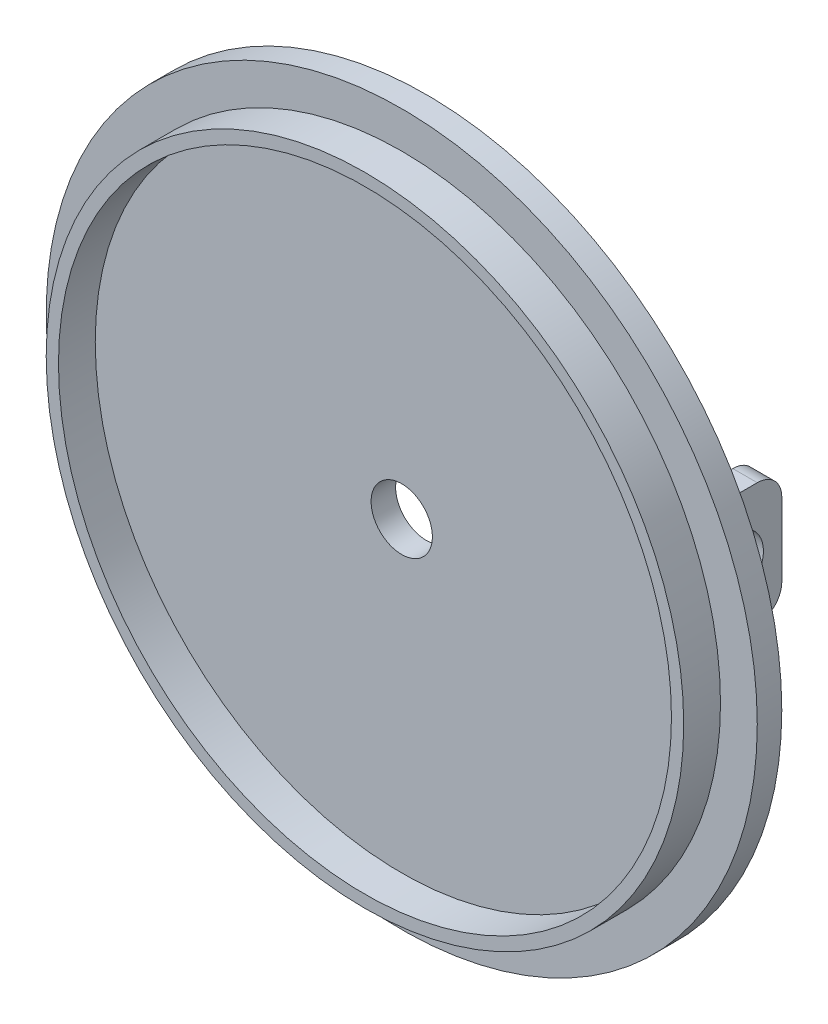
ISO-10303-21;
HEADER;
FILE_DESCRIPTION(('STEP AP214'),'2;1');
FILE_NAME('part.step','',(''),(''),'','','');
FILE_SCHEMA(('AUTOMOTIVE_DESIGN { 1 0 10303 214 1 1 1 1 }'));
ENDSEC;
DATA;
#1=APPLICATION_CONTEXT('core data for automotive mechanical design processes');
#2=APPLICATION_PROTOCOL_DEFINITION('international standard','automotive_design',2000,#1);
#3=PRODUCT_CONTEXT('',#1,'mechanical');
#4=PRODUCT('Part','Part','',(#3));
#5=PRODUCT_RELATED_PRODUCT_CATEGORY('part','',(#4));
#6=PRODUCT_DEFINITION_FORMATION('','',#4);
#7=PRODUCT_DEFINITION_CONTEXT('part definition',#1,'design');
#8=PRODUCT_DEFINITION('design','',#6,#7);
#9=PRODUCT_DEFINITION_SHAPE('','',#8);
#10=(LENGTH_UNIT() NAMED_UNIT(*) SI_UNIT(.MILLI.,.METRE.));
#11=(NAMED_UNIT(*) PLANE_ANGLE_UNIT() SI_UNIT($,.RADIAN.));
#12=(NAMED_UNIT(*) SI_UNIT($,.STERADIAN.) SOLID_ANGLE_UNIT());
#13=UNCERTAINTY_MEASURE_WITH_UNIT(LENGTH_MEASURE(1.E-05),#10,'distance_accuracy_value','');
#14=(GEOMETRIC_REPRESENTATION_CONTEXT(3) GLOBAL_UNCERTAINTY_ASSIGNED_CONTEXT((#13)) GLOBAL_UNIT_ASSIGNED_CONTEXT((#10,
#11,#12)) REPRESENTATION_CONTEXT('',''));
#15=CARTESIAN_POINT('',(0.,0.,0.));
#16=DIRECTION('',(0.,0.,1.));
#17=DIRECTION('',(1.,0.,0.));
#18=AXIS2_PLACEMENT_3D('',#15,#16,#17);
#19=CARTESIAN_POINT('',(0.,0.,0.));
#20=DIRECTION('',(0.,0.,1.));
#21=DIRECTION('',(1.,0.,0.));
#22=AXIS2_PLACEMENT_3D('',#19,#20,#21);
#23=PLANE('',#22);
#24=CARTESIAN_POINT('',(16.,7.5,0.));
#25=DIRECTION('',(0.,0.,-1.));
#26=DIRECTION('',(-1.,0.,0.));
#27=AXIS2_PLACEMENT_3D('',#24,#25,#26);
#28=CIRCLE('',#27,2.25);
#29=CARTESIAN_POINT('',(13.75,7.5,0.));
#30=VERTEX_POINT('',#29);
#31=CARTESIAN_POINT('',(18.25,7.5,0.));
#32=VERTEX_POINT('',#31);
#33=EDGE_CURVE('E306',#30,#32,#28,.T.);
#34=ORIENTED_EDGE('',*,*,#33,.F.);
#35=DIRECTION('',(0.,1.,0.));
#36=VECTOR('',#35,1.);
#37=CARTESIAN_POINT('',(13.75,7.5,0.));
#38=LINE('',#37,#36);
#39=CARTESIAN_POINT('',(13.75,-7.5,0.));
#40=VERTEX_POINT('',#39);
#41=EDGE_CURVE('E312',#40,#30,#38,.T.);
#42=ORIENTED_EDGE('',*,*,#41,.F.);
#43=CARTESIAN_POINT('',(16.,-7.5,0.));
#44=DIRECTION('',(0.,0.,-1.));
#45=DIRECTION('',(-1.,0.,0.));
#46=AXIS2_PLACEMENT_3D('',#43,#44,#45);
#47=CIRCLE('',#46,2.25);
#48=CARTESIAN_POINT('',(18.25,-7.5,0.));
#49=VERTEX_POINT('',#48);
#50=EDGE_CURVE('E329',#49,#40,#47,.T.);
#51=ORIENTED_EDGE('',*,*,#50,.F.);
#52=DIRECTION('',(0.,-1.,0.));
#53=VECTOR('',#52,1.);
#54=CARTESIAN_POINT('',(18.25,7.5,0.));
#55=LINE('',#54,#53);
#56=EDGE_CURVE('E325',#32,#49,#55,.T.);
#57=ORIENTED_EDGE('',*,*,#56,.F.);
#58=EDGE_LOOP('',(#34,#42,#51,#57));
#59=FACE_BOUND('',#58,.T.);
#60=CARTESIAN_POINT('',(0.,0.,0.));
#61=DIRECTION('',(0.,0.,1.));
#62=DIRECTION('',(1.,0.,0.));
#63=AXIS2_PLACEMENT_3D('',#60,#61,#62);
#64=CIRCLE('',#63,29.);
#65=CARTESIAN_POINT('',(29.,0.,0.));
#66=VERTEX_POINT('',#65);
#67=EDGE_CURVE('E368',#66,#66,#64,.T.);
#68=ORIENTED_EDGE('',*,*,#67,.F.);
#69=EDGE_LOOP('',(#68));
#70=FACE_BOUND('',#69,.T.);
#71=CARTESIAN_POINT('',(0.,0.,0.));
#72=DIRECTION('',(0.,0.,1.));
#73=DIRECTION('',(1.,0.,0.));
#74=AXIS2_PLACEMENT_3D('',#71,#72,#73);
#75=CIRCLE('',#74,2.5);
#76=CARTESIAN_POINT('',(2.5,0.,0.));
#77=VERTEX_POINT('',#76);
#78=EDGE_CURVE('E360',#77,#77,#75,.T.);
#79=ORIENTED_EDGE('',*,*,#78,.T.);
#80=EDGE_LOOP('',(#79));
#81=FACE_BOUND('',#80,.T.);
#82=CARTESIAN_POINT('',(-16.,7.5,0.));
#83=DIRECTION('',(0.,0.,-1.));
#84=DIRECTION('',(-1.,0.,0.));
#85=AXIS2_PLACEMENT_3D('',#82,#83,#84);
#86=CIRCLE('',#85,2.25);
#87=CARTESIAN_POINT('',(-18.25,7.5,0.));
#88=VERTEX_POINT('',#87);
#89=CARTESIAN_POINT('',(-13.75,7.5,0.));
#90=VERTEX_POINT('',#89);
#91=EDGE_CURVE('E261',#88,#90,#86,.T.);
#92=ORIENTED_EDGE('',*,*,#91,.F.);
#93=DIRECTION('',(0.,1.,0.));
#94=VECTOR('',#93,1.);
#95=CARTESIAN_POINT('',(-18.25,7.5,0.));
#96=LINE('',#95,#94);
#97=CARTESIAN_POINT('',(-18.25,-7.5,0.));
#98=VERTEX_POINT('',#97);
#99=EDGE_CURVE('E267',#98,#88,#96,.T.);
#100=ORIENTED_EDGE('',*,*,#99,.F.);
#101=CARTESIAN_POINT('',(-16.,-7.5,0.));
#102=DIRECTION('',(0.,0.,-1.));
#103=DIRECTION('',(-1.,0.,0.));
#104=AXIS2_PLACEMENT_3D('',#101,#102,#103);
#105=CIRCLE('',#104,2.25);
#106=CARTESIAN_POINT('',(-13.75,-7.5,0.));
#107=VERTEX_POINT('',#106);
#108=EDGE_CURVE('E284',#107,#98,#105,.T.);
#109=ORIENTED_EDGE('',*,*,#108,.F.);
#110=DIRECTION('',(0.,-1.,0.));
#111=VECTOR('',#110,1.);
#112=CARTESIAN_POINT('',(-13.75,7.5,0.));
#113=LINE('',#112,#111);
#114=EDGE_CURVE('E280',#90,#107,#113,.T.);
#115=ORIENTED_EDGE('',*,*,#114,.F.);
#116=EDGE_LOOP('',(#92,#100,#109,#115));
#117=FACE_BOUND('',#116,.T.);
#118=ADVANCED_FACE('F43',(#59,#70,#81,#117),#23,.F.);
#119=CARTESIAN_POINT('',(0.,0.,2.));
#120=DIRECTION('',(0.,0.,1.));
#121=DIRECTION('',(1.,0.,0.));
#122=AXIS2_PLACEMENT_3D('',#119,#120,#121);
#123=PLANE('',#122);
#124=CARTESIAN_POINT('',(0.,0.,2.));
#125=DIRECTION('',(0.,0.,1.));
#126=DIRECTION('',(1.,0.,0.));
#127=AXIS2_PLACEMENT_3D('',#124,#125,#126);
#128=CIRCLE('',#127,2.5);
#129=CARTESIAN_POINT('',(2.5,0.,2.));
#130=VERTEX_POINT('',#129);
#131=EDGE_CURVE('E364',#130,#130,#128,.T.);
#132=ORIENTED_EDGE('',*,*,#131,.F.);
#133=EDGE_LOOP('',(#132));
#134=FACE_BOUND('',#133,.T.);
#135=CARTESIAN_POINT('',(0.,0.,2.));
#136=DIRECTION('',(0.,0.,1.));
#137=DIRECTION('',(1.,0.,0.));
#138=AXIS2_PLACEMENT_3D('',#135,#136,#137);
#139=CIRCLE('',#138,25.);
#140=CARTESIAN_POINT('',(25.,0.,2.));
#141=VERTEX_POINT('',#140);
#142=EDGE_CURVE('E376',#141,#141,#139,.F.);
#143=ORIENTED_EDGE('',*,*,#142,.F.);
#144=EDGE_LOOP('',(#143));
#145=FACE_BOUND('',#144,.T.);
#146=ADVANCED_FACE('F474',(#134,#145),#123,.T.);
#147=CARTESIAN_POINT('',(0.,0.,2.));
#148=DIRECTION('',(0.,0.,1.));
#149=DIRECTION('',(1.,0.,0.));
#150=AXIS2_PLACEMENT_3D('',#147,#148,#149);
#151=CIRCLE('',#150,26.);
#152=CARTESIAN_POINT('',(26.,0.,2.));
#153=VERTEX_POINT('',#152);
#154=EDGE_CURVE('E355',#153,#153,#151,.T.);
#155=ORIENTED_EDGE('',*,*,#154,.F.);
#156=EDGE_LOOP('',(#155));
#157=FACE_BOUND('',#156,.T.);
#158=CARTESIAN_POINT('',(0.,0.,2.));
#159=DIRECTION('',(0.,0.,1.));
#160=DIRECTION('',(1.,0.,0.));
#161=AXIS2_PLACEMENT_3D('',#158,#159,#160);
#162=CIRCLE('',#161,29.);
#163=CARTESIAN_POINT('',(29.,0.,2.));
#164=VERTEX_POINT('',#163);
#165=EDGE_CURVE('E372',#164,#164,#162,.T.);
#166=ORIENTED_EDGE('',*,*,#165,.T.);
#167=EDGE_LOOP('',(#166));
#168=FACE_BOUND('',#167,.T.);
#169=ADVANCED_FACE('F480',(#157,#168),#123,.T.);
#170=CARTESIAN_POINT('',(0.,0.,2.));
#171=DIRECTION('',(0.,0.,-1.));
#172=DIRECTION('',(-1.,0.,0.));
#173=AXIS2_PLACEMENT_3D('',#170,#171,#172);
#174=CYLINDRICAL_SURFACE('',#173,29.);
#175=ORIENTED_EDGE('',*,*,#165,.F.);
#176=EDGE_LOOP('',(#175));
#177=FACE_BOUND('',#176,.T.);
#178=ORIENTED_EDGE('',*,*,#67,.T.);
#179=EDGE_LOOP('',(#178));
#180=FACE_BOUND('',#179,.T.);
#181=ADVANCED_FACE('F486',(#177,#180),#174,.T.);
#182=CARTESIAN_POINT('',(0.,0.,2.));
#183=DIRECTION('',(0.,0.,-1.));
#184=DIRECTION('',(-1.,0.,0.));
#185=AXIS2_PLACEMENT_3D('',#182,#183,#184);
#186=CYLINDRICAL_SURFACE('',#185,2.5);
#187=ORIENTED_EDGE('',*,*,#131,.T.);
#188=EDGE_LOOP('',(#187));
#189=FACE_BOUND('',#188,.T.);
#190=ORIENTED_EDGE('',*,*,#78,.F.);
#191=EDGE_LOOP('',(#190));
#192=FACE_BOUND('',#191,.T.);
#193=ADVANCED_FACE('F489',(#189,#192),#186,.F.);
#194=CARTESIAN_POINT('',(0.,0.,5.));
#195=DIRECTION('',(0.,0.,1.));
#196=DIRECTION('',(1.,0.,0.));
#197=AXIS2_PLACEMENT_3D('',#194,#195,#196);
#198=PLANE('',#197);
#199=CARTESIAN_POINT('',(0.,0.,5.));
#200=DIRECTION('',(0.,0.,1.));
#201=DIRECTION('',(1.,0.,0.));
#202=AXIS2_PLACEMENT_3D('',#199,#200,#201);
#203=CIRCLE('',#202,26.);
#204=CARTESIAN_POINT('',(26.,0.,5.));
#205=VERTEX_POINT('',#204);
#206=EDGE_CURVE('E356',#205,#205,#203,.T.);
#207=ORIENTED_EDGE('',*,*,#206,.T.);
#208=EDGE_LOOP('',(#207));
#209=FACE_BOUND('',#208,.T.);
#210=CARTESIAN_POINT('',(0.,0.,5.));
#211=DIRECTION('',(0.,0.,1.));
#212=DIRECTION('',(1.,0.,0.));
#213=AXIS2_PLACEMENT_3D('',#210,#211,#212);
#214=CIRCLE('',#213,25.);
#215=CARTESIAN_POINT('',(25.,0.,5.));
#216=VERTEX_POINT('',#215);
#217=EDGE_CURVE('E351',#216,#216,#214,.T.);
#218=ORIENTED_EDGE('',*,*,#217,.F.);
#219=EDGE_LOOP('',(#218));
#220=FACE_BOUND('',#219,.T.);
#221=ADVANCED_FACE('F650',(#209,#220),#198,.T.);
#222=CARTESIAN_POINT('',(0.,0.,5.));
#223=DIRECTION('',(0.,0.,-1.));
#224=DIRECTION('',(-1.,0.,0.));
#225=AXIS2_PLACEMENT_3D('',#222,#223,#224);
#226=CYLINDRICAL_SURFACE('',#225,26.);
#227=ORIENTED_EDGE('',*,*,#206,.F.);
#228=EDGE_LOOP('',(#227));
#229=FACE_BOUND('',#228,.T.);
#230=ORIENTED_EDGE('',*,*,#154,.T.);
#231=EDGE_LOOP('',(#230));
#232=FACE_BOUND('',#231,.T.);
#233=ADVANCED_FACE('F648',(#229,#232),#226,.T.);
#234=CARTESIAN_POINT('',(0.,0.,5.));
#235=DIRECTION('',(0.,0.,-1.));
#236=DIRECTION('',(-1.,0.,0.));
#237=AXIS2_PLACEMENT_3D('',#234,#235,#236);
#238=CYLINDRICAL_SURFACE('',#237,25.);
#239=ORIENTED_EDGE('',*,*,#217,.T.);
#240=EDGE_LOOP('',(#239));
#241=FACE_BOUND('',#240,.T.);
#242=ORIENTED_EDGE('',*,*,#142,.T.);
#243=EDGE_LOOP('',(#242));
#244=FACE_BOUND('',#243,.T.);
#245=ADVANCED_FACE('F644',(#241,#244),#238,.F.);
#246=CARTESIAN_POINT('',(16.,7.5,-2.));
#247=DIRECTION('',(0.,0.,1.));
#248=DIRECTION('',(1.,0.,0.));
#249=AXIS2_PLACEMENT_3D('',#246,#247,#248);
#250=CYLINDRICAL_SURFACE('',#249,2.25);
#251=ORIENTED_EDGE('',*,*,#33,.T.);
#252=DIRECTION('',(0.,0.,1.));
#253=VECTOR('',#252,1.);
#254=CARTESIAN_POINT('',(18.25,7.5,-2.));
#255=LINE('',#254,#253);
#256=CARTESIAN_POINT('',(18.25,7.5,-2.));
#257=VERTEX_POINT('',#256);
#258=EDGE_CURVE('E347',#257,#32,#255,.T.);
#259=ORIENTED_EDGE('',*,*,#258,.F.);
#260=CARTESIAN_POINT('',(16.,7.5,-2.));
#261=DIRECTION('',(0.,0.,-1.));
#262=DIRECTION('',(-1.,0.,0.));
#263=AXIS2_PLACEMENT_3D('',#260,#261,#262);
#264=CIRCLE('',#263,2.25);
#265=CARTESIAN_POINT('',(13.75,7.5,-2.));
#266=VERTEX_POINT('',#265);
#267=EDGE_CURVE('E307',#266,#257,#264,.T.);
#268=ORIENTED_EDGE('',*,*,#267,.F.);
#269=DIRECTION('',(0.,0.,1.));
#270=VECTOR('',#269,1.);
#271=CARTESIAN_POINT('',(13.75,7.5,-2.));
#272=LINE('',#271,#270);
#273=EDGE_CURVE('E321',#266,#30,#272,.T.);
#274=ORIENTED_EDGE('',*,*,#273,.T.);
#275=EDGE_LOOP('',(#251,#259,#268,#274));
#276=FACE_BOUND('',#275,.T.);
#277=ADVANCED_FACE('F640',(#276),#250,.T.);
#278=CARTESIAN_POINT('',(18.25,7.5,-2.));
#279=DIRECTION('',(-1.,0.,0.));
#280=DIRECTION('',(0.,0.,1.));
#281=AXIS2_PLACEMENT_3D('',#278,#279,#280);
#282=PLANE('',#281);
#283=ORIENTED_EDGE('',*,*,#56,.T.);
#284=DIRECTION('',(0.,0.,1.));
#285=VECTOR('',#284,1.);
#286=CARTESIAN_POINT('',(18.25,-7.5,-2.));
#287=LINE('',#286,#285);
#288=CARTESIAN_POINT('',(18.25,-7.5,-2.));
#289=VERTEX_POINT('',#288);
#290=EDGE_CURVE('E343',#289,#49,#287,.T.);
#291=ORIENTED_EDGE('',*,*,#290,.F.);
#292=DIRECTION('',(0.,-1.,0.));
#293=VECTOR('',#292,1.);
#294=CARTESIAN_POINT('',(18.25,7.5,-2.));
#295=LINE('',#294,#293);
#296=EDGE_CURVE('E311',#257,#289,#295,.T.);
#297=ORIENTED_EDGE('',*,*,#296,.F.);
#298=ORIENTED_EDGE('',*,*,#258,.T.);
#299=EDGE_LOOP('',(#283,#291,#297,#298));
#300=FACE_BOUND('',#299,.T.);
#301=ADVANCED_FACE('F636',(#300),#282,.F.);
#302=CARTESIAN_POINT('',(16.,-7.5,-2.));
#303=DIRECTION('',(0.,0.,1.));
#304=DIRECTION('',(1.,0.,0.));
#305=AXIS2_PLACEMENT_3D('',#302,#303,#304);
#306=CYLINDRICAL_SURFACE('',#305,2.25);
#307=ORIENTED_EDGE('',*,*,#50,.T.);
#308=DIRECTION('',(0.,0.,1.));
#309=VECTOR('',#308,1.);
#310=CARTESIAN_POINT('',(13.75,-7.5,-2.));
#311=LINE('',#310,#309);
#312=CARTESIAN_POINT('',(13.75,-7.5,-2.));
#313=VERTEX_POINT('',#312);
#314=EDGE_CURVE('E339',#313,#40,#311,.T.);
#315=ORIENTED_EDGE('',*,*,#314,.F.);
#316=CARTESIAN_POINT('',(16.,-7.5,-2.));
#317=DIRECTION('',(0.,0.,-1.));
#318=DIRECTION('',(-1.,0.,0.));
#319=AXIS2_PLACEMENT_3D('',#316,#317,#318);
#320=CIRCLE('',#319,2.25);
#321=EDGE_CURVE('E315',#289,#313,#320,.T.);
#322=ORIENTED_EDGE('',*,*,#321,.F.);
#323=ORIENTED_EDGE('',*,*,#290,.T.);
#324=EDGE_LOOP('',(#307,#315,#322,#323));
#325=FACE_BOUND('',#324,.T.);
#326=ADVANCED_FACE('F632',(#325),#306,.T.);
#327=CARTESIAN_POINT('',(13.75,7.5,-2.));
#328=DIRECTION('',(1.,0.,0.));
#329=DIRECTION('',(0.,1.,0.));
#330=AXIS2_PLACEMENT_3D('',#327,#328,#329);
#331=PLANE('',#330);
#332=ORIENTED_EDGE('',*,*,#41,.T.);
#333=ORIENTED_EDGE('',*,*,#273,.F.);
#334=DIRECTION('',(0.,1.,0.));
#335=VECTOR('',#334,1.);
#336=CARTESIAN_POINT('',(13.75,7.5,-2.));
#337=LINE('',#336,#335);
#338=EDGE_CURVE('E318',#313,#266,#337,.T.);
#339=ORIENTED_EDGE('',*,*,#338,.F.);
#340=ORIENTED_EDGE('',*,*,#314,.T.);
#341=EDGE_LOOP('',(#332,#333,#339,#340));
#342=FACE_BOUND('',#341,.T.);
#343=ADVANCED_FACE('F628',(#342),#331,.F.);
#344=CARTESIAN_POINT('',(16.,7.5,-2.));
#345=DIRECTION('',(0.,0.,-1.));
#346=DIRECTION('',(-1.,0.,0.));
#347=AXIS2_PLACEMENT_3D('',#344,#345,#346);
#348=PLANE('',#347);
#349=DIRECTION('',(0.,1.,0.));
#350=VECTOR('',#349,1.);
#351=CARTESIAN_POINT('',(15.,5.07539605048808,-2.));
#352=LINE('',#351,#350);
#353=CARTESIAN_POINT('',(15.,-4.92460394951192,-2.));
#354=VERTEX_POINT('',#353);
#355=CARTESIAN_POINT('',(15.,5.07539605048808,-2.));
#356=VERTEX_POINT('',#355);
#357=EDGE_CURVE('E225',#354,#356,#352,.T.);
#358=ORIENTED_EDGE('',*,*,#357,.F.);
#359=DIRECTION('',(-1.,0.,0.));
#360=VECTOR('',#359,1.);
#361=CARTESIAN_POINT('',(17.,-4.92460394951192,-2.));
#362=LINE('',#361,#360);
#363=CARTESIAN_POINT('',(17.,-4.92460394951192,-2.));
#364=VERTEX_POINT('',#363);
#365=EDGE_CURVE('E231',#364,#354,#362,.T.);
#366=ORIENTED_EDGE('',*,*,#365,.F.);
#367=DIRECTION('',(0.,-1.,0.));
#368=VECTOR('',#367,1.);
#369=CARTESIAN_POINT('',(17.,5.07539605048808,-2.));
#370=LINE('',#369,#368);
#371=CARTESIAN_POINT('',(17.,5.07539605048808,-2.));
#372=VERTEX_POINT('',#371);
#373=EDGE_CURVE('E243',#372,#364,#370,.T.);
#374=ORIENTED_EDGE('',*,*,#373,.F.);
#375=DIRECTION('',(1.,0.,0.));
#376=VECTOR('',#375,1.);
#377=CARTESIAN_POINT('',(17.,5.07539605048808,-2.));
#378=LINE('',#377,#376);
#379=EDGE_CURVE('E239',#356,#372,#378,.T.);
#380=ORIENTED_EDGE('',*,*,#379,.F.);
#381=EDGE_LOOP('',(#358,#366,#374,#380));
#382=FACE_BOUND('',#381,.T.);
#383=ORIENTED_EDGE('',*,*,#267,.T.);
#384=ORIENTED_EDGE('',*,*,#296,.T.);
#385=ORIENTED_EDGE('',*,*,#321,.T.);
#386=ORIENTED_EDGE('',*,*,#338,.T.);
#387=EDGE_LOOP('',(#383,#384,#385,#386));
#388=FACE_BOUND('',#387,.T.);
#389=ADVANCED_FACE('F624',(#382,#388),#348,.T.);
#390=CARTESIAN_POINT('',(-16.,7.5,-2.));
#391=DIRECTION('',(0.,0.,1.));
#392=DIRECTION('',(1.,0.,0.));
#393=AXIS2_PLACEMENT_3D('',#390,#391,#392);
#394=CYLINDRICAL_SURFACE('',#393,2.25);
#395=ORIENTED_EDGE('',*,*,#91,.T.);
#396=DIRECTION('',(0.,0.,1.));
#397=VECTOR('',#396,1.);
#398=CARTESIAN_POINT('',(-13.75,7.5,-2.));
#399=LINE('',#398,#397);
#400=CARTESIAN_POINT('',(-13.75,7.5,-2.));
#401=VERTEX_POINT('',#400);
#402=EDGE_CURVE('E302',#401,#90,#399,.T.);
#403=ORIENTED_EDGE('',*,*,#402,.F.);
#404=CARTESIAN_POINT('',(-16.,7.5,-2.));
#405=DIRECTION('',(0.,0.,-1.));
#406=DIRECTION('',(-1.,0.,0.));
#407=AXIS2_PLACEMENT_3D('',#404,#405,#406);
#408=CIRCLE('',#407,2.25);
#409=CARTESIAN_POINT('',(-18.25,7.5,-2.));
#410=VERTEX_POINT('',#409);
#411=EDGE_CURVE('E262',#410,#401,#408,.T.);
#412=ORIENTED_EDGE('',*,*,#411,.F.);
#413=DIRECTION('',(0.,0.,1.));
#414=VECTOR('',#413,1.);
#415=CARTESIAN_POINT('',(-18.25,7.5,-2.));
#416=LINE('',#415,#414);
#417=EDGE_CURVE('E276',#410,#88,#416,.T.);
#418=ORIENTED_EDGE('',*,*,#417,.T.);
#419=EDGE_LOOP('',(#395,#403,#412,#418));
#420=FACE_BOUND('',#419,.T.);
#421=ADVANCED_FACE('F620',(#420),#394,.T.);
#422=CARTESIAN_POINT('',(-13.75,7.5,-2.));
#423=DIRECTION('',(-1.,0.,0.));
#424=DIRECTION('',(0.,0.,1.));
#425=AXIS2_PLACEMENT_3D('',#422,#423,#424);
#426=PLANE('',#425);
#427=ORIENTED_EDGE('',*,*,#114,.T.);
#428=DIRECTION('',(0.,0.,1.));
#429=VECTOR('',#428,1.);
#430=CARTESIAN_POINT('',(-13.75,-7.5,-2.));
#431=LINE('',#430,#429);
#432=CARTESIAN_POINT('',(-13.75,-7.5,-2.));
#433=VERTEX_POINT('',#432);
#434=EDGE_CURVE('E298',#433,#107,#431,.T.);
#435=ORIENTED_EDGE('',*,*,#434,.F.);
#436=DIRECTION('',(0.,-1.,0.));
#437=VECTOR('',#436,1.);
#438=CARTESIAN_POINT('',(-13.75,7.5,-2.));
#439=LINE('',#438,#437);
#440=EDGE_CURVE('E266',#401,#433,#439,.T.);
#441=ORIENTED_EDGE('',*,*,#440,.F.);
#442=ORIENTED_EDGE('',*,*,#402,.T.);
#443=EDGE_LOOP('',(#427,#435,#441,#442));
#444=FACE_BOUND('',#443,.T.);
#445=ADVANCED_FACE('F616',(#444),#426,.F.);
#446=CARTESIAN_POINT('',(-16.,-7.5,-2.));
#447=DIRECTION('',(0.,0.,1.));
#448=DIRECTION('',(1.,0.,0.));
#449=AXIS2_PLACEMENT_3D('',#446,#447,#448);
#450=CYLINDRICAL_SURFACE('',#449,2.25);
#451=ORIENTED_EDGE('',*,*,#108,.T.);
#452=DIRECTION('',(0.,0.,1.));
#453=VECTOR('',#452,1.);
#454=CARTESIAN_POINT('',(-18.25,-7.5,-2.));
#455=LINE('',#454,#453);
#456=CARTESIAN_POINT('',(-18.25,-7.5,-2.));
#457=VERTEX_POINT('',#456);
#458=EDGE_CURVE('E294',#457,#98,#455,.T.);
#459=ORIENTED_EDGE('',*,*,#458,.F.);
#460=CARTESIAN_POINT('',(-16.,-7.5,-2.));
#461=DIRECTION('',(0.,0.,-1.));
#462=DIRECTION('',(-1.,0.,0.));
#463=AXIS2_PLACEMENT_3D('',#460,#461,#462);
#464=CIRCLE('',#463,2.25);
#465=EDGE_CURVE('E270',#433,#457,#464,.T.);
#466=ORIENTED_EDGE('',*,*,#465,.F.);
#467=ORIENTED_EDGE('',*,*,#434,.T.);
#468=EDGE_LOOP('',(#451,#459,#466,#467));
#469=FACE_BOUND('',#468,.T.);
#470=ADVANCED_FACE('F612',(#469),#450,.T.);
#471=CARTESIAN_POINT('',(-18.25,7.5,-2.));
#472=DIRECTION('',(1.,0.,0.));
#473=DIRECTION('',(0.,0.,-1.));
#474=AXIS2_PLACEMENT_3D('',#471,#472,#473);
#475=PLANE('',#474);
#476=ORIENTED_EDGE('',*,*,#99,.T.);
#477=ORIENTED_EDGE('',*,*,#417,.F.);
#478=DIRECTION('',(0.,1.,0.));
#479=VECTOR('',#478,1.);
#480=CARTESIAN_POINT('',(-18.25,7.5,-2.));
#481=LINE('',#480,#479);
#482=EDGE_CURVE('E273',#457,#410,#481,.T.);
#483=ORIENTED_EDGE('',*,*,#482,.F.);
#484=ORIENTED_EDGE('',*,*,#458,.T.);
#485=EDGE_LOOP('',(#476,#477,#483,#484));
#486=FACE_BOUND('',#485,.T.);
#487=ADVANCED_FACE('F609',(#486),#475,.F.);
#488=CARTESIAN_POINT('',(-16.,7.5,-2.));
#489=DIRECTION('',(0.,0.,-1.));
#490=DIRECTION('',(-1.,0.,0.));
#491=AXIS2_PLACEMENT_3D('',#488,#489,#490);
#492=PLANE('',#491);
#493=DIRECTION('',(0.,1.,0.));
#494=VECTOR('',#493,1.);
#495=CARTESIAN_POINT('',(-17.,5.07539605048808,-2.));
#496=LINE('',#495,#494);
#497=CARTESIAN_POINT('',(-17.,-4.92460394951192,-2.));
#498=VERTEX_POINT('',#497);
#499=CARTESIAN_POINT('',(-17.,5.07539605048808,-2.));
#500=VERTEX_POINT('',#499);
#501=EDGE_CURVE('E207',#498,#500,#496,.T.);
#502=ORIENTED_EDGE('',*,*,#501,.F.);
#503=DIRECTION('',(-1.,0.,0.));
#504=VECTOR('',#503,1.);
#505=CARTESIAN_POINT('',(-17.,-4.92460394951192,-2.));
#506=LINE('',#505,#504);
#507=CARTESIAN_POINT('',(-15.,-4.92460394951192,-2.));
#508=VERTEX_POINT('',#507);
#509=EDGE_CURVE('E202',#508,#498,#506,.T.);
#510=ORIENTED_EDGE('',*,*,#509,.F.);
#511=DIRECTION('',(0.,-1.,0.));
#512=VECTOR('',#511,1.);
#513=CARTESIAN_POINT('',(-15.,5.07539605048808,-2.));
#514=LINE('',#513,#512);
#515=CARTESIAN_POINT('',(-15.,5.07539605048808,-2.));
#516=VERTEX_POINT('',#515);
#517=EDGE_CURVE('E186',#516,#508,#514,.T.);
#518=ORIENTED_EDGE('',*,*,#517,.F.);
#519=DIRECTION('',(1.,0.,0.));
#520=VECTOR('',#519,1.);
#521=CARTESIAN_POINT('',(-17.,5.07539605048808,-2.));
#522=LINE('',#521,#520);
#523=EDGE_CURVE('E199',#500,#516,#522,.T.);
#524=ORIENTED_EDGE('',*,*,#523,.F.);
#525=EDGE_LOOP('',(#502,#510,#518,#524));
#526=FACE_BOUND('',#525,.T.);
#527=ORIENTED_EDGE('',*,*,#411,.T.);
#528=ORIENTED_EDGE('',*,*,#440,.T.);
#529=ORIENTED_EDGE('',*,*,#465,.T.);
#530=ORIENTED_EDGE('',*,*,#482,.T.);
#531=EDGE_LOOP('',(#527,#528,#529,#530));
#532=FACE_BOUND('',#531,.T.);
#533=ADVANCED_FACE('F197',(#526,#532),#492,.T.);
#534=CARTESIAN_POINT('',(15.,5.07539605048808,-12.));
#535=DIRECTION('',(1.,0.,0.));
#536=DIRECTION('',(0.,1.,0.));
#537=AXIS2_PLACEMENT_3D('',#534,#535,#536);
#538=PLANE('',#537);
#539=CARTESIAN_POINT('',(15.,0.,-8.));
#540=DIRECTION('',(1.,0.,0.));
#541=DIRECTION('',(0.,1.,0.));
#542=AXIS2_PLACEMENT_3D('',#539,#540,#541);
#543=CIRCLE('',#542,2.5);
#544=CARTESIAN_POINT('',(15.,2.49999999999999,-8.));
#545=VERTEX_POINT('',#544);
#546=EDGE_CURVE('E210',#545,#545,#543,.T.);
#547=ORIENTED_EDGE('',*,*,#546,.T.);
#548=EDGE_LOOP('',(#547));
#549=FACE_BOUND('',#548,.T.);
#550=DIRECTION('',(0.,0.,1.));
#551=VECTOR('',#550,1.);
#552=CARTESIAN_POINT('',(15.,5.07539605048808,-12.));
#553=LINE('',#552,#551);
#554=CARTESIAN_POINT('',(15.,5.07539605048808,-10.));
#555=VERTEX_POINT('',#554);
#556=EDGE_CURVE('E258',#555,#356,#553,.T.);
#557=ORIENTED_EDGE('',*,*,#556,.F.);
#558=CARTESIAN_POINT('',(15.,3.07539605048808,-10.));
#559=DIRECTION('',(1.,0.,0.));
#560=DIRECTION('',(0.,1.,0.));
#561=AXIS2_PLACEMENT_3D('',#558,#559,#560);
#562=CIRCLE('',#561,2.);
#563=CARTESIAN_POINT('',(15.,3.07539605048808,-12.));
#564=VERTEX_POINT('',#563);
#565=EDGE_CURVE('E403',#555,#564,#562,.F.);
#566=ORIENTED_EDGE('',*,*,#565,.T.);
#567=DIRECTION('',(0.,1.,0.));
#568=VECTOR('',#567,1.);
#569=CARTESIAN_POINT('',(15.,5.07539605048808,-12.));
#570=LINE('',#569,#568);
#571=CARTESIAN_POINT('',(15.,-2.92460394951192,-12.));
#572=VERTEX_POINT('',#571);
#573=EDGE_CURVE('E226',#572,#564,#570,.T.);
#574=ORIENTED_EDGE('',*,*,#573,.F.);
#575=CARTESIAN_POINT('',(15.,-2.92460394951192,-10.));
#576=DIRECTION('',(1.,0.,0.));
#577=DIRECTION('',(0.,1.,0.));
#578=AXIS2_PLACEMENT_3D('',#575,#576,#577);
#579=CIRCLE('',#578,2.);
#580=CARTESIAN_POINT('',(15.,-4.92460394951192,-10.));
#581=VERTEX_POINT('',#580);
#582=EDGE_CURVE('E400',#572,#581,#579,.F.);
#583=ORIENTED_EDGE('',*,*,#582,.T.);
#584=DIRECTION('',(0.,0.,1.));
#585=VECTOR('',#584,1.);
#586=CARTESIAN_POINT('',(15.,-4.92460394951192,-12.));
#587=LINE('',#586,#585);
#588=EDGE_CURVE('E235',#581,#354,#587,.T.);
#589=ORIENTED_EDGE('',*,*,#588,.T.);
#590=ORIENTED_EDGE('',*,*,#357,.T.);
#591=EDGE_LOOP('',(#557,#566,#574,#583,#589,#590));
#592=FACE_BOUND('',#591,.T.);
#593=ADVANCED_FACE('F513',(#549,#592),#538,.F.);
#594=CARTESIAN_POINT('',(17.,5.07539605048808,-12.));
#595=DIRECTION('',(0.,-1.,0.));
#596=DIRECTION('',(0.,0.,-1.));
#597=AXIS2_PLACEMENT_3D('',#594,#595,#596);
#598=PLANE('',#597);
#599=DIRECTION('',(0.,0.,1.));
#600=VECTOR('',#599,1.);
#601=CARTESIAN_POINT('',(17.,5.07539605048808,-12.));
#602=LINE('',#601,#600);
#603=CARTESIAN_POINT('',(17.,5.07539605048808,-10.));
#604=VERTEX_POINT('',#603);
#605=EDGE_CURVE('E255',#604,#372,#602,.T.);
#606=ORIENTED_EDGE('',*,*,#605,.F.);
#607=DIRECTION('',(1.,0.,0.));
#608=VECTOR('',#607,1.);
#609=CARTESIAN_POINT('',(15.,5.07539605048808,-10.));
#610=LINE('',#609,#608);
#611=EDGE_CURVE('E397',#604,#555,#610,.F.);
#612=ORIENTED_EDGE('',*,*,#611,.T.);
#613=ORIENTED_EDGE('',*,*,#556,.T.);
#614=ORIENTED_EDGE('',*,*,#379,.T.);
#615=EDGE_LOOP('',(#606,#612,#613,#614));
#616=FACE_BOUND('',#615,.T.);
#617=ADVANCED_FACE('F518',(#616),#598,.F.);
#618=CARTESIAN_POINT('',(17.,5.07539605048808,-12.));
#619=DIRECTION('',(-1.,0.,0.));
#620=DIRECTION('',(0.,-1.,0.));
#621=AXIS2_PLACEMENT_3D('',#618,#619,#620);
#622=PLANE('',#621);
#623=CARTESIAN_POINT('',(17.,0.,-8.));
#624=DIRECTION('',(-1.,0.,0.));
#625=DIRECTION('',(0.,-1.,0.));
#626=AXIS2_PLACEMENT_3D('',#623,#624,#625);
#627=CIRCLE('',#626,2.5);
#628=CARTESIAN_POINT('',(17.,-2.50000000000001,-8.));
#629=VERTEX_POINT('',#628);
#630=EDGE_CURVE('E448',#629,#629,#627,.T.);
#631=ORIENTED_EDGE('',*,*,#630,.T.);
#632=EDGE_LOOP('',(#631));
#633=FACE_BOUND('',#632,.T.);
#634=DIRECTION('',(0.,-1.,0.));
#635=VECTOR('',#634,1.);
#636=CARTESIAN_POINT('',(17.,5.07539605048808,-12.));
#637=LINE('',#636,#635);
#638=CARTESIAN_POINT('',(17.,3.07539605048808,-12.));
#639=VERTEX_POINT('',#638);
#640=CARTESIAN_POINT('',(17.,-2.92460394951192,-12.));
#641=VERTEX_POINT('',#640);
#642=EDGE_CURVE('E230',#639,#641,#637,.T.);
#643=ORIENTED_EDGE('',*,*,#642,.F.);
#644=CARTESIAN_POINT('',(17.,3.07539605048808,-10.));
#645=DIRECTION('',(-1.,0.,0.));
#646=DIRECTION('',(0.,-1.,0.));
#647=AXIS2_PLACEMENT_3D('',#644,#645,#646);
#648=CIRCLE('',#647,2.);
#649=EDGE_CURVE('E394',#639,#604,#648,.F.);
#650=ORIENTED_EDGE('',*,*,#649,.T.);
#651=ORIENTED_EDGE('',*,*,#605,.T.);
#652=ORIENTED_EDGE('',*,*,#373,.T.);
#653=DIRECTION('',(0.,0.,1.));
#654=VECTOR('',#653,1.);
#655=CARTESIAN_POINT('',(17.,-4.92460394951192,-12.));
#656=LINE('',#655,#654);
#657=CARTESIAN_POINT('',(17.,-4.92460394951192,-10.));
#658=VERTEX_POINT('',#657);
#659=EDGE_CURVE('E252',#658,#364,#656,.T.);
#660=ORIENTED_EDGE('',*,*,#659,.F.);
#661=CARTESIAN_POINT('',(17.,-2.92460394951192,-10.));
#662=DIRECTION('',(-1.,0.,0.));
#663=DIRECTION('',(0.,-1.,0.));
#664=AXIS2_PLACEMENT_3D('',#661,#662,#663);
#665=CIRCLE('',#664,2.);
#666=EDGE_CURVE('E391',#658,#641,#665,.F.);
#667=ORIENTED_EDGE('',*,*,#666,.T.);
#668=EDGE_LOOP('',(#643,#650,#651,#652,#660,#667));
#669=FACE_BOUND('',#668,.T.);
#670=ADVANCED_FACE('F528',(#633,#669),#622,.F.);
#671=CARTESIAN_POINT('',(17.,-4.92460394951192,-12.));
#672=DIRECTION('',(0.,1.,0.));
#673=DIRECTION('',(0.,0.,1.));
#674=AXIS2_PLACEMENT_3D('',#671,#672,#673);
#675=PLANE('',#674);
#676=ORIENTED_EDGE('',*,*,#588,.F.);
#677=DIRECTION('',(-1.,0.,0.));
#678=VECTOR('',#677,1.);
#679=CARTESIAN_POINT('',(17.,-4.92460394951192,-10.));
#680=LINE('',#679,#678);
#681=EDGE_CURVE('E11',#581,#658,#680,.F.);
#682=ORIENTED_EDGE('',*,*,#681,.T.);
#683=ORIENTED_EDGE('',*,*,#659,.T.);
#684=ORIENTED_EDGE('',*,*,#365,.T.);
#685=EDGE_LOOP('',(#676,#682,#683,#684));
#686=FACE_BOUND('',#685,.T.);
#687=ADVANCED_FACE('F533',(#686),#675,.F.);
#688=CARTESIAN_POINT('',(0.,0.,-12.));
#689=DIRECTION('',(0.,0.,-1.));
#690=DIRECTION('',(-1.,0.,0.));
#691=AXIS2_PLACEMENT_3D('',#688,#689,#690);
#692=PLANE('',#691);
#693=ORIENTED_EDGE('',*,*,#573,.T.);
#694=DIRECTION('',(1.,0.,0.));
#695=VECTOR('',#694,1.);
#696=CARTESIAN_POINT('',(17.,3.07539605048808,-12.));
#697=LINE('',#696,#695);
#698=EDGE_CURVE('E387',#564,#639,#697,.T.);
#699=ORIENTED_EDGE('',*,*,#698,.T.);
#700=ORIENTED_EDGE('',*,*,#642,.T.);
#701=DIRECTION('',(-1.,0.,0.));
#702=VECTOR('',#701,1.);
#703=CARTESIAN_POINT('',(15.,-2.92460394951192,-12.));
#704=LINE('',#703,#702);
#705=EDGE_CURVE('E383',#641,#572,#704,.T.);
#706=ORIENTED_EDGE('',*,*,#705,.T.);
#707=EDGE_LOOP('',(#693,#699,#700,#706));
#708=FACE_BOUND('',#707,.T.);
#709=ADVANCED_FACE('F545',(#708),#692,.T.);
#710=CARTESIAN_POINT('',(-17.,5.07539605048808,-12.));
#711=DIRECTION('',(1.,0.,0.));
#712=DIRECTION('',(0.,1.,0.));
#713=AXIS2_PLACEMENT_3D('',#710,#711,#712);
#714=PLANE('',#713);
#715=CARTESIAN_POINT('',(-17.,0.,-8.));
#716=DIRECTION('',(-1.,0.,0.));
#717=DIRECTION('',(0.,-1.,0.));
#718=AXIS2_PLACEMENT_3D('',#715,#716,#717);
#719=CIRCLE('',#718,2.5);
#720=CARTESIAN_POINT('',(-17.,-2.49999999999999,-8.));
#721=VERTEX_POINT('',#720);
#722=EDGE_CURVE('E452',#721,#721,#719,.T.);
#723=ORIENTED_EDGE('',*,*,#722,.F.);
#724=EDGE_LOOP('',(#723));
#725=FACE_BOUND('',#724,.T.);
#726=DIRECTION('',(0.,0.,1.));
#727=VECTOR('',#726,1.);
#728=CARTESIAN_POINT('',(-17.,5.07539605048808,-12.));
#729=LINE('',#728,#727);
#730=CARTESIAN_POINT('',(-17.,5.07539605048808,-10.));
#731=VERTEX_POINT('',#730);
#732=EDGE_CURVE('E190',#731,#500,#729,.T.);
#733=ORIENTED_EDGE('',*,*,#732,.F.);
#734=CARTESIAN_POINT('',(-17.,3.07539605048808,-10.));
#735=DIRECTION('',(1.,0.,0.));
#736=DIRECTION('',(0.,1.,0.));
#737=AXIS2_PLACEMENT_3D('',#734,#735,#736);
#738=CIRCLE('',#737,2.);
#739=CARTESIAN_POINT('',(-17.,3.07539605048808,-12.));
#740=VERTEX_POINT('',#739);
#741=EDGE_CURVE('E423',#731,#740,#738,.F.);
#742=ORIENTED_EDGE('',*,*,#741,.T.);
#743=DIRECTION('',(0.,1.,0.));
#744=VECTOR('',#743,1.);
#745=CARTESIAN_POINT('',(-17.,5.07539605048808,-12.));
#746=LINE('',#745,#744);
#747=CARTESIAN_POINT('',(-17.,-2.92460394951192,-12.));
#748=VERTEX_POINT('',#747);
#749=EDGE_CURVE('E216',#748,#740,#746,.T.);
#750=ORIENTED_EDGE('',*,*,#749,.F.);
#751=CARTESIAN_POINT('',(-17.,-2.92460394951192,-10.));
#752=DIRECTION('',(1.,0.,0.));
#753=DIRECTION('',(0.,1.,0.));
#754=AXIS2_PLACEMENT_3D('',#751,#752,#753);
#755=CIRCLE('',#754,2.);
#756=CARTESIAN_POINT('',(-17.,-4.92460394951192,-10.));
#757=VERTEX_POINT('',#756);
#758=EDGE_CURVE('E60',#748,#757,#755,.F.);
#759=ORIENTED_EDGE('',*,*,#758,.T.);
#760=DIRECTION('',(0.,0.,1.));
#761=VECTOR('',#760,1.);
#762=CARTESIAN_POINT('',(-17.,-4.92460394951192,-12.));
#763=LINE('',#762,#761);
#764=EDGE_CURVE('E217',#757,#498,#763,.T.);
#765=ORIENTED_EDGE('',*,*,#764,.T.);
#766=ORIENTED_EDGE('',*,*,#501,.T.);
#767=EDGE_LOOP('',(#733,#742,#750,#759,#765,#766));
#768=FACE_BOUND('',#767,.T.);
#769=ADVANCED_FACE('F439',(#725,#768),#714,.F.);
#770=CARTESIAN_POINT('',(-17.,5.07539605048808,-12.));
#771=DIRECTION('',(0.,-1.,0.));
#772=DIRECTION('',(1.,0.,0.));
#773=AXIS2_PLACEMENT_3D('',#770,#771,#772);
#774=PLANE('',#773);
#775=DIRECTION('',(0.,0.,1.));
#776=VECTOR('',#775,1.);
#777=CARTESIAN_POINT('',(-15.,5.07539605048808,-12.));
#778=LINE('',#777,#776);
#779=CARTESIAN_POINT('',(-15.,5.07539605048808,-10.));
#780=VERTEX_POINT('',#779);
#781=EDGE_CURVE('E181',#780,#516,#778,.T.);
#782=ORIENTED_EDGE('',*,*,#781,.F.);
#783=DIRECTION('',(1.,0.,0.));
#784=VECTOR('',#783,1.);
#785=CARTESIAN_POINT('',(-17.,5.07539605048808,-10.));
#786=LINE('',#785,#784);
#787=EDGE_CURVE('E68',#780,#731,#786,.F.);
#788=ORIENTED_EDGE('',*,*,#787,.T.);
#789=ORIENTED_EDGE('',*,*,#732,.T.);
#790=ORIENTED_EDGE('',*,*,#523,.T.);
#791=EDGE_LOOP('',(#782,#788,#789,#790));
#792=FACE_BOUND('',#791,.T.);
#793=ADVANCED_FACE('F205',(#792),#774,.F.);
#794=CARTESIAN_POINT('',(-15.,5.07539605048808,-12.));
#795=DIRECTION('',(-1.,0.,0.));
#796=DIRECTION('',(0.,-1.,0.));
#797=AXIS2_PLACEMENT_3D('',#794,#795,#796);
#798=PLANE('',#797);
#799=CARTESIAN_POINT('',(-15.,0.,-8.));
#800=DIRECTION('',(-1.,0.,0.));
#801=DIRECTION('',(0.,-1.,0.));
#802=AXIS2_PLACEMENT_3D('',#799,#800,#801);
#803=CIRCLE('',#802,2.5);
#804=CARTESIAN_POINT('',(-15.,-2.49999999999999,-8.));
#805=VERTEX_POINT('',#804);
#806=EDGE_CURVE('E47',#805,#805,#803,.T.);
#807=ORIENTED_EDGE('',*,*,#806,.T.);
#808=EDGE_LOOP('',(#807));
#809=FACE_BOUND('',#808,.T.);
#810=DIRECTION('',(0.,-1.,0.));
#811=VECTOR('',#810,1.);
#812=CARTESIAN_POINT('',(-15.,5.07539605048808,-12.));
#813=LINE('',#812,#811);
#814=CARTESIAN_POINT('',(-15.,3.07539605048808,-12.));
#815=VERTEX_POINT('',#814);
#816=CARTESIAN_POINT('',(-15.,-2.92460394951192,-12.));
#817=VERTEX_POINT('',#816);
#818=EDGE_CURVE('E220',#815,#817,#813,.T.);
#819=ORIENTED_EDGE('',*,*,#818,.F.);
#820=CARTESIAN_POINT('',(-15.,3.07539605048808,-10.));
#821=DIRECTION('',(-1.,0.,0.));
#822=DIRECTION('',(0.,-1.,0.));
#823=AXIS2_PLACEMENT_3D('',#820,#821,#822);
#824=CIRCLE('',#823,2.);
#825=EDGE_CURVE('E187',#815,#780,#824,.F.);
#826=ORIENTED_EDGE('',*,*,#825,.T.);
#827=ORIENTED_EDGE('',*,*,#781,.T.);
#828=ORIENTED_EDGE('',*,*,#517,.T.);
#829=DIRECTION('',(0.,0.,1.));
#830=VECTOR('',#829,1.);
#831=CARTESIAN_POINT('',(-15.,-4.92460394951192,-12.));
#832=LINE('',#831,#830);
#833=CARTESIAN_POINT('',(-15.,-4.92460394951192,-10.));
#834=VERTEX_POINT('',#833);
#835=EDGE_CURVE('E191',#834,#508,#832,.T.);
#836=ORIENTED_EDGE('',*,*,#835,.F.);
#837=CARTESIAN_POINT('',(-15.,-2.92460394951192,-10.));
#838=DIRECTION('',(-1.,0.,0.));
#839=DIRECTION('',(0.,-1.,0.));
#840=AXIS2_PLACEMENT_3D('',#837,#838,#839);
#841=CIRCLE('',#840,2.);
#842=EDGE_CURVE('E414',#834,#817,#841,.F.);
#843=ORIENTED_EDGE('',*,*,#842,.T.);
#844=EDGE_LOOP('',(#819,#826,#827,#828,#836,#843));
#845=FACE_BOUND('',#844,.T.);
#846=ADVANCED_FACE('F184',(#809,#845),#798,.F.);
#847=CARTESIAN_POINT('',(-17.,-4.92460394951192,-12.));
#848=DIRECTION('',(0.,1.,0.));
#849=DIRECTION('',(-1.,0.,0.));
#850=AXIS2_PLACEMENT_3D('',#847,#848,#849);
#851=PLANE('',#850);
#852=ORIENTED_EDGE('',*,*,#764,.F.);
#853=DIRECTION('',(-1.,0.,0.));
#854=VECTOR('',#853,1.);
#855=CARTESIAN_POINT('',(-17.,-4.92460394951192,-10.));
#856=LINE('',#855,#854);
#857=EDGE_CURVE('E53',#757,#834,#856,.F.);
#858=ORIENTED_EDGE('',*,*,#857,.T.);
#859=ORIENTED_EDGE('',*,*,#835,.T.);
#860=ORIENTED_EDGE('',*,*,#509,.T.);
#861=EDGE_LOOP('',(#852,#858,#859,#860));
#862=FACE_BOUND('',#861,.T.);
#863=ADVANCED_FACE('F429',(#862),#851,.F.);
#864=CARTESIAN_POINT('',(0.,0.,-12.));
#865=DIRECTION('',(0.,0.,1.));
#866=DIRECTION('',(1.,0.,0.));
#867=AXIS2_PLACEMENT_3D('',#864,#865,#866);
#868=PLANE('',#867);
#869=ORIENTED_EDGE('',*,*,#749,.T.);
#870=DIRECTION('',(1.,0.,0.));
#871=VECTOR('',#870,1.);
#872=CARTESIAN_POINT('',(0.,3.07539605048807,-12.));
#873=LINE('',#872,#871);
#874=EDGE_CURVE('E410',#740,#815,#873,.T.);
#875=ORIENTED_EDGE('',*,*,#874,.T.);
#876=ORIENTED_EDGE('',*,*,#818,.T.);
#877=DIRECTION('',(-1.,0.,0.));
#878=VECTOR('',#877,1.);
#879=CARTESIAN_POINT('',(0.,-2.92460394951193,-12.));
#880=LINE('',#879,#878);
#881=EDGE_CURVE('E406',#817,#748,#880,.T.);
#882=ORIENTED_EDGE('',*,*,#881,.T.);
#883=EDGE_LOOP('',(#869,#875,#876,#882));
#884=FACE_BOUND('',#883,.T.);
#885=ADVANCED_FACE('F437',(#884),#868,.F.);
#886=CARTESIAN_POINT('',(0.,3.07539605048808,-10.));
#887=DIRECTION('',(-1.,0.,0.));
#888=DIRECTION('',(0.,0.,1.));
#889=AXIS2_PLACEMENT_3D('',#886,#887,#888);
#890=CYLINDRICAL_SURFACE('',#889,2.);
#891=ORIENTED_EDGE('',*,*,#565,.F.);
#892=ORIENTED_EDGE('',*,*,#611,.F.);
#893=ORIENTED_EDGE('',*,*,#649,.F.);
#894=ORIENTED_EDGE('',*,*,#698,.F.);
#895=EDGE_LOOP('',(#891,#892,#893,#894));
#896=FACE_BOUND('',#895,.T.);
#897=ADVANCED_FACE('F491',(#896),#890,.T.);
#898=CARTESIAN_POINT('',(0.,3.07539605048807,-10.));
#899=DIRECTION('',(1.,0.,0.));
#900=DIRECTION('',(0.,1.,0.));
#901=AXIS2_PLACEMENT_3D('',#898,#899,#900);
#902=CYLINDRICAL_SURFACE('',#901,2.);
#903=ORIENTED_EDGE('',*,*,#741,.F.);
#904=ORIENTED_EDGE('',*,*,#787,.F.);
#905=ORIENTED_EDGE('',*,*,#825,.F.);
#906=ORIENTED_EDGE('',*,*,#874,.F.);
#907=EDGE_LOOP('',(#903,#904,#905,#906));
#908=FACE_BOUND('',#907,.T.);
#909=ADVANCED_FACE('F494',(#908),#902,.T.);
#910=CARTESIAN_POINT('',(0.,-2.92460394951193,-10.));
#911=DIRECTION('',(-1.,0.,0.));
#912=DIRECTION('',(0.,-1.,0.));
#913=AXIS2_PLACEMENT_3D('',#910,#911,#912);
#914=CYLINDRICAL_SURFACE('',#913,2.);
#915=ORIENTED_EDGE('',*,*,#842,.F.);
#916=ORIENTED_EDGE('',*,*,#857,.F.);
#917=ORIENTED_EDGE('',*,*,#758,.F.);
#918=ORIENTED_EDGE('',*,*,#881,.F.);
#919=EDGE_LOOP('',(#915,#916,#917,#918));
#920=FACE_BOUND('',#919,.T.);
#921=ADVANCED_FACE('F434',(#920),#914,.T.);
#922=CARTESIAN_POINT('',(0.,-2.92460394951192,-10.));
#923=DIRECTION('',(1.,0.,0.));
#924=DIRECTION('',(0.,0.,-1.));
#925=AXIS2_PLACEMENT_3D('',#922,#923,#924);
#926=CYLINDRICAL_SURFACE('',#925,2.);
#927=ORIENTED_EDGE('',*,*,#666,.F.);
#928=ORIENTED_EDGE('',*,*,#681,.F.);
#929=ORIENTED_EDGE('',*,*,#582,.F.);
#930=ORIENTED_EDGE('',*,*,#705,.F.);
#931=EDGE_LOOP('',(#927,#928,#929,#930));
#932=FACE_BOUND('',#931,.T.);
#933=ADVANCED_FACE('F45',(#932),#926,.T.);
#934=CARTESIAN_POINT('',(29.,0.,-8.));
#935=DIRECTION('',(-1.,0.,0.));
#936=DIRECTION('',(0.,-1.,0.));
#937=AXIS2_PLACEMENT_3D('',#934,#935,#936);
#938=CYLINDRICAL_SURFACE('',#937,2.5);
#939=ORIENTED_EDGE('',*,*,#722,.T.);
#940=EDGE_LOOP('',(#939));
#941=FACE_BOUND('',#940,.T.);
#942=ORIENTED_EDGE('',*,*,#806,.F.);
#943=EDGE_LOOP('',(#942));
#944=FACE_BOUND('',#943,.T.);
#945=ADVANCED_FACE('F462',(#941,#944),#938,.F.);
#946=ORIENTED_EDGE('',*,*,#630,.F.);
#947=EDGE_LOOP('',(#946));
#948=FACE_BOUND('',#947,.T.);
#949=ORIENTED_EDGE('',*,*,#546,.F.);
#950=EDGE_LOOP('',(#949));
#951=FACE_BOUND('',#950,.T.);
#952=ADVANCED_FACE('F464',(#948,#951),#938,.F.);
#953=CLOSED_SHELL('',(#118,#146,#169,#181,#193,#221,#233,#245,#277,#301,#326,#343,#389,#421,
#445,#470,#487,#533,#593,#617,#670,#687,#709,#769,#793,#846,#863,#885,#897,#909,#921,#933,#945,#952));
#954=MANIFOLD_SOLID_BREP('B2',#953);
#955=ADVANCED_BREP_SHAPE_REPRESENTATION('',(#18,#954),#14);
#956=SHAPE_DEFINITION_REPRESENTATION(#9,#955);
ENDSEC;
END-ISO-10303-21;
